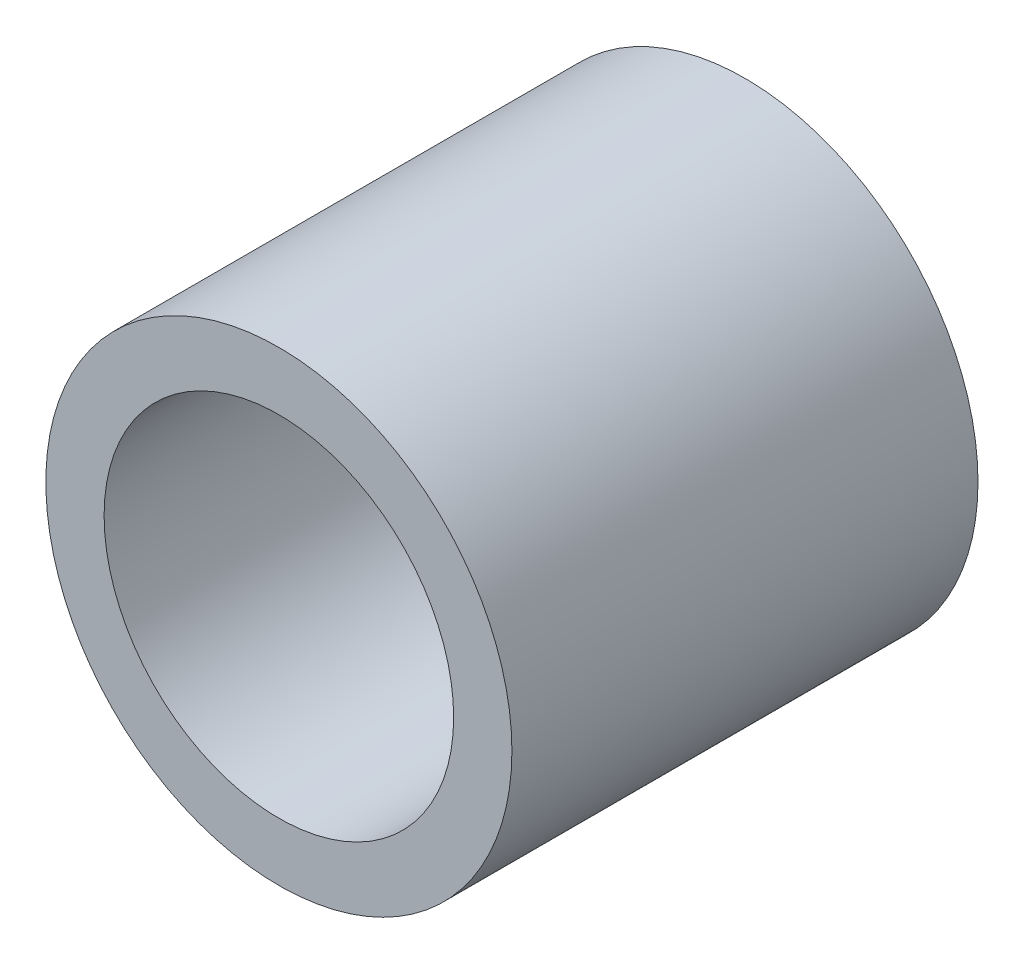
ISO-10303-21;
HEADER;
FILE_DESCRIPTION(('STEP AP214'),'2;1');
FILE_NAME('part.step','',(''),(''),'','','');
FILE_SCHEMA(('AUTOMOTIVE_DESIGN { 1 0 10303 214 1 1 1 1 }'));
ENDSEC;
DATA;
#1=APPLICATION_CONTEXT('core data for automotive mechanical design processes');
#2=APPLICATION_PROTOCOL_DEFINITION('international standard','automotive_design',2000,#1);
#3=PRODUCT_CONTEXT('',#1,'mechanical');
#4=PRODUCT('Part','Part','',(#3));
#5=PRODUCT_RELATED_PRODUCT_CATEGORY('part','',(#4));
#6=PRODUCT_DEFINITION_FORMATION('','',#4);
#7=PRODUCT_DEFINITION_CONTEXT('part definition',#1,'design');
#8=PRODUCT_DEFINITION('design','',#6,#7);
#9=PRODUCT_DEFINITION_SHAPE('','',#8);
#10=(LENGTH_UNIT() NAMED_UNIT(*) SI_UNIT(.MILLI.,.METRE.));
#11=(NAMED_UNIT(*) PLANE_ANGLE_UNIT() SI_UNIT($,.RADIAN.));
#12=(NAMED_UNIT(*) SI_UNIT($,.STERADIAN.) SOLID_ANGLE_UNIT());
#13=UNCERTAINTY_MEASURE_WITH_UNIT(LENGTH_MEASURE(1.E-05),#10,'distance_accuracy_value','');
#14=(GEOMETRIC_REPRESENTATION_CONTEXT(3) GLOBAL_UNCERTAINTY_ASSIGNED_CONTEXT((#13)) GLOBAL_UNIT_ASSIGNED_CONTEXT((#10,
#11,#12)) REPRESENTATION_CONTEXT('',''));
#15=CARTESIAN_POINT('',(0.,0.,0.));
#16=DIRECTION('',(0.,0.,1.));
#17=DIRECTION('',(1.,0.,0.));
#18=AXIS2_PLACEMENT_3D('',#15,#16,#17);
#19=CARTESIAN_POINT('',(0.,0.,12.7));
#20=DIRECTION('',(0.,0.,1.));
#21=DIRECTION('',(1.,0.,0.));
#22=AXIS2_PLACEMENT_3D('',#19,#20,#21);
#23=PLANE('',#22);
#24=CARTESIAN_POINT('',(0.,0.,12.7));
#25=DIRECTION('',(0.,0.,1.));
#26=DIRECTION('',(1.,0.,0.));
#27=AXIS2_PLACEMENT_3D('',#24,#25,#26);
#28=CIRCLE('',#27,12.7);
#29=CARTESIAN_POINT('',(12.7,0.,12.7));
#30=VERTEX_POINT('',#29);
#31=EDGE_CURVE('E10',#30,#30,#28,.T.);
#32=ORIENTED_EDGE('',*,*,#31,.T.);
#33=EDGE_LOOP('',(#32));
#34=FACE_BOUND('',#33,.T.);
#35=CARTESIAN_POINT('',(0.,0.,12.7));
#36=DIRECTION('',(0.,0.,1.));
#37=DIRECTION('',(1.,0.,0.));
#38=AXIS2_PLACEMENT_3D('',#35,#36,#37);
#39=CIRCLE('',#38,9.525);
#40=CARTESIAN_POINT('',(9.525,0.,12.7));
#41=VERTEX_POINT('',#40);
#42=EDGE_CURVE('E42',#41,#41,#39,.T.);
#43=ORIENTED_EDGE('',*,*,#42,.F.);
#44=EDGE_LOOP('',(#43));
#45=FACE_BOUND('',#44,.T.);
#46=ADVANCED_FACE('F31',(#34,#45),#23,.T.);
#47=CARTESIAN_POINT('',(0.,0.,-12.7));
#48=DIRECTION('',(0.,0.,1.));
#49=DIRECTION('',(1.,0.,0.));
#50=AXIS2_PLACEMENT_3D('',#47,#48,#49);
#51=PLANE('',#50);
#52=CARTESIAN_POINT('',(0.,0.,-12.7));
#53=DIRECTION('',(0.,0.,1.));
#54=DIRECTION('',(1.,0.,0.));
#55=AXIS2_PLACEMENT_3D('',#52,#53,#54);
#56=CIRCLE('',#55,12.7);
#57=CARTESIAN_POINT('',(12.7,0.,-12.7));
#58=VERTEX_POINT('',#57);
#59=EDGE_CURVE('E35',#58,#58,#56,.T.);
#60=ORIENTED_EDGE('',*,*,#59,.F.);
#61=EDGE_LOOP('',(#60));
#62=FACE_BOUND('',#61,.T.);
#63=CARTESIAN_POINT('',(0.,0.,-12.7));
#64=DIRECTION('',(0.,0.,1.));
#65=DIRECTION('',(1.,0.,0.));
#66=AXIS2_PLACEMENT_3D('',#63,#64,#65);
#67=CIRCLE('',#66,9.525);
#68=CARTESIAN_POINT('',(9.525,0.,-12.7));
#69=VERTEX_POINT('',#68);
#70=EDGE_CURVE('E44',#69,#69,#67,.T.);
#71=ORIENTED_EDGE('',*,*,#70,.T.);
#72=EDGE_LOOP('',(#71));
#73=FACE_BOUND('',#72,.T.);
#74=ADVANCED_FACE('F54',(#62,#73),#51,.F.);
#75=CARTESIAN_POINT('',(0.,0.,12.7));
#76=DIRECTION('',(0.,0.,-1.));
#77=DIRECTION('',(-1.,0.,0.));
#78=AXIS2_PLACEMENT_3D('',#75,#76,#77);
#79=CYLINDRICAL_SURFACE('',#78,12.7);
#80=ORIENTED_EDGE('',*,*,#31,.F.);
#81=EDGE_LOOP('',(#80));
#82=FACE_BOUND('',#81,.T.);
#83=ORIENTED_EDGE('',*,*,#59,.T.);
#84=EDGE_LOOP('',(#83));
#85=FACE_BOUND('',#84,.T.);
#86=ADVANCED_FACE('F33',(#82,#85),#79,.T.);
#87=CARTESIAN_POINT('',(0.,0.,12.7));
#88=DIRECTION('',(0.,0.,-1.));
#89=DIRECTION('',(-1.,0.,0.));
#90=AXIS2_PLACEMENT_3D('',#87,#88,#89);
#91=CYLINDRICAL_SURFACE('',#90,9.525);
#92=ORIENTED_EDGE('',*,*,#42,.T.);
#93=EDGE_LOOP('',(#92));
#94=FACE_BOUND('',#93,.T.);
#95=ORIENTED_EDGE('',*,*,#70,.F.);
#96=EDGE_LOOP('',(#95));
#97=FACE_BOUND('',#96,.T.);
#98=ADVANCED_FACE('F50',(#94,#97),#91,.F.);
#99=CLOSED_SHELL('',(#46,#74,#86,#98));
#100=MANIFOLD_SOLID_BREP('B2',#99);
#101=ADVANCED_BREP_SHAPE_REPRESENTATION('',(#18,#100),#14);
#102=SHAPE_DEFINITION_REPRESENTATION(#9,#101);
ENDSEC;
END-ISO-10303-21;
